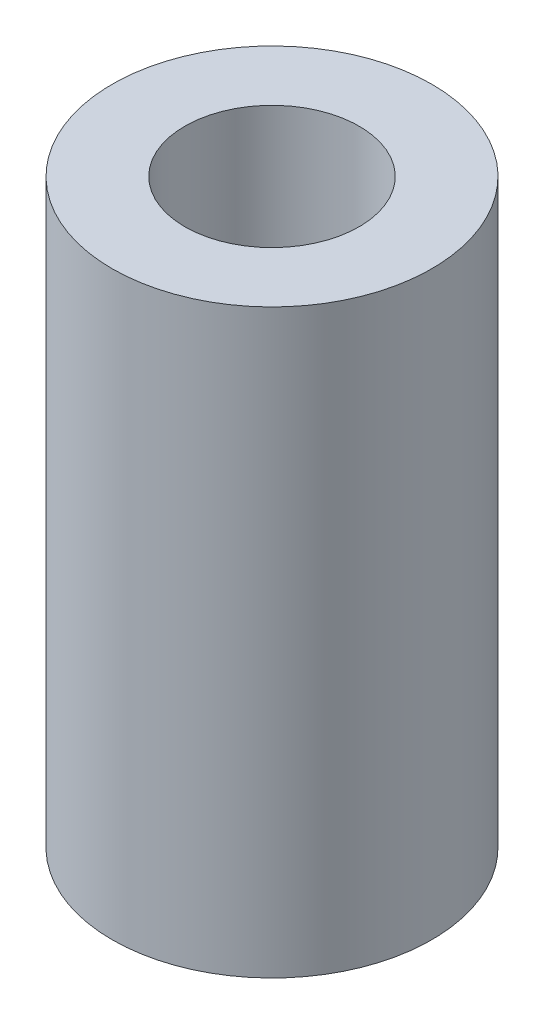
ISO-10303-21;
HEADER;
FILE_DESCRIPTION(('STEP AP214'),'2;1');
FILE_NAME('part.step','',(''),(''),'','','');
FILE_SCHEMA(('AUTOMOTIVE_DESIGN { 1 0 10303 214 1 1 1 1 }'));
ENDSEC;
DATA;
#1=APPLICATION_CONTEXT('core data for automotive mechanical design processes');
#2=APPLICATION_PROTOCOL_DEFINITION('international standard','automotive_design',2000,#1);
#3=PRODUCT_CONTEXT('',#1,'mechanical');
#4=PRODUCT('Part','Part','',(#3));
#5=PRODUCT_RELATED_PRODUCT_CATEGORY('part','',(#4));
#6=PRODUCT_DEFINITION_FORMATION('','',#4);
#7=PRODUCT_DEFINITION_CONTEXT('part definition',#1,'design');
#8=PRODUCT_DEFINITION('design','',#6,#7);
#9=PRODUCT_DEFINITION_SHAPE('','',#8);
#10=(LENGTH_UNIT() NAMED_UNIT(*) SI_UNIT(.MILLI.,.METRE.));
#11=(NAMED_UNIT(*) PLANE_ANGLE_UNIT() SI_UNIT($,.RADIAN.));
#12=(NAMED_UNIT(*) SI_UNIT($,.STERADIAN.) SOLID_ANGLE_UNIT());
#13=UNCERTAINTY_MEASURE_WITH_UNIT(LENGTH_MEASURE(1.E-05),#10,'distance_accuracy_value','');
#14=(GEOMETRIC_REPRESENTATION_CONTEXT(3) GLOBAL_UNCERTAINTY_ASSIGNED_CONTEXT((#13)) GLOBAL_UNIT_ASSIGNED_CONTEXT((#10,
#11,#12)) REPRESENTATION_CONTEXT('',''));
#15=CARTESIAN_POINT('',(0.,0.,0.));
#16=DIRECTION('',(0.,0.,1.));
#17=DIRECTION('',(1.,0.,0.));
#18=AXIS2_PLACEMENT_3D('',#15,#16,#17);
#19=CARTESIAN_POINT('',(0.,12.,0.));
#20=DIRECTION('',(0.,1.,0.));
#21=DIRECTION('',(0.,0.,1.));
#22=AXIS2_PLACEMENT_3D('',#19,#20,#21);
#23=PLANE('',#22);
#24=CARTESIAN_POINT('',(0.,12.,0.));
#25=DIRECTION('',(0.,1.,0.));
#26=DIRECTION('',(0.,0.,1.));
#27=AXIS2_PLACEMENT_3D('',#24,#25,#26);
#28=CIRCLE('',#27,3.3);
#29=CARTESIAN_POINT('',(0.,12.,3.3));
#30=VERTEX_POINT('',#29);
#31=EDGE_CURVE('E10',#30,#30,#28,.T.);
#32=ORIENTED_EDGE('',*,*,#31,.T.);
#33=EDGE_LOOP('',(#32));
#34=FACE_BOUND('',#33,.T.);
#35=CARTESIAN_POINT('',(0.,12.,0.));
#36=DIRECTION('',(0.,1.,0.));
#37=DIRECTION('',(0.,0.,1.));
#38=AXIS2_PLACEMENT_3D('',#35,#36,#37);
#39=CIRCLE('',#38,1.8);
#40=CARTESIAN_POINT('',(0.,12.,1.8));
#41=VERTEX_POINT('',#40);
#42=EDGE_CURVE('E42',#41,#41,#39,.T.);
#43=ORIENTED_EDGE('',*,*,#42,.F.);
#44=EDGE_LOOP('',(#43));
#45=FACE_BOUND('',#44,.T.);
#46=ADVANCED_FACE('F31',(#34,#45),#23,.T.);
#47=CARTESIAN_POINT('',(0.,0.,0.));
#48=DIRECTION('',(0.,1.,0.));
#49=DIRECTION('',(0.,0.,1.));
#50=AXIS2_PLACEMENT_3D('',#47,#48,#49);
#51=PLANE('',#50);
#52=CARTESIAN_POINT('',(0.,0.,0.));
#53=DIRECTION('',(0.,1.,0.));
#54=DIRECTION('',(0.,0.,1.));
#55=AXIS2_PLACEMENT_3D('',#52,#53,#54);
#56=CIRCLE('',#55,3.3);
#57=CARTESIAN_POINT('',(0.,0.,3.3));
#58=VERTEX_POINT('',#57);
#59=EDGE_CURVE('E35',#58,#58,#56,.T.);
#60=ORIENTED_EDGE('',*,*,#59,.F.);
#61=EDGE_LOOP('',(#60));
#62=FACE_BOUND('',#61,.T.);
#63=CARTESIAN_POINT('',(0.,0.,0.));
#64=DIRECTION('',(0.,1.,0.));
#65=DIRECTION('',(0.,0.,1.));
#66=AXIS2_PLACEMENT_3D('',#63,#64,#65);
#67=CIRCLE('',#66,1.8);
#68=CARTESIAN_POINT('',(0.,0.,1.8));
#69=VERTEX_POINT('',#68);
#70=EDGE_CURVE('E44',#69,#69,#67,.T.);
#71=ORIENTED_EDGE('',*,*,#70,.T.);
#72=EDGE_LOOP('',(#71));
#73=FACE_BOUND('',#72,.T.);
#74=ADVANCED_FACE('F54',(#62,#73),#51,.F.);
#75=CARTESIAN_POINT('',(0.,12.,0.));
#76=DIRECTION('',(0.,-1.,0.));
#77=DIRECTION('',(0.,0.,-1.));
#78=AXIS2_PLACEMENT_3D('',#75,#76,#77);
#79=CYLINDRICAL_SURFACE('',#78,3.3);
#80=ORIENTED_EDGE('',*,*,#31,.F.);
#81=EDGE_LOOP('',(#80));
#82=FACE_BOUND('',#81,.T.);
#83=ORIENTED_EDGE('',*,*,#59,.T.);
#84=EDGE_LOOP('',(#83));
#85=FACE_BOUND('',#84,.T.);
#86=ADVANCED_FACE('F33',(#82,#85),#79,.T.);
#87=CARTESIAN_POINT('',(0.,12.,0.));
#88=DIRECTION('',(0.,-1.,0.));
#89=DIRECTION('',(0.,0.,-1.));
#90=AXIS2_PLACEMENT_3D('',#87,#88,#89);
#91=CYLINDRICAL_SURFACE('',#90,1.8);
#92=ORIENTED_EDGE('',*,*,#42,.T.);
#93=EDGE_LOOP('',(#92));
#94=FACE_BOUND('',#93,.T.);
#95=ORIENTED_EDGE('',*,*,#70,.F.);
#96=EDGE_LOOP('',(#95));
#97=FACE_BOUND('',#96,.T.);
#98=ADVANCED_FACE('F50',(#94,#97),#91,.F.);
#99=CLOSED_SHELL('',(#46,#74,#86,#98));
#100=MANIFOLD_SOLID_BREP('B2',#99);
#101=ADVANCED_BREP_SHAPE_REPRESENTATION('',(#18,#100),#14);
#102=SHAPE_DEFINITION_REPRESENTATION(#9,#101);
ENDSEC;
END-ISO-10303-21;
